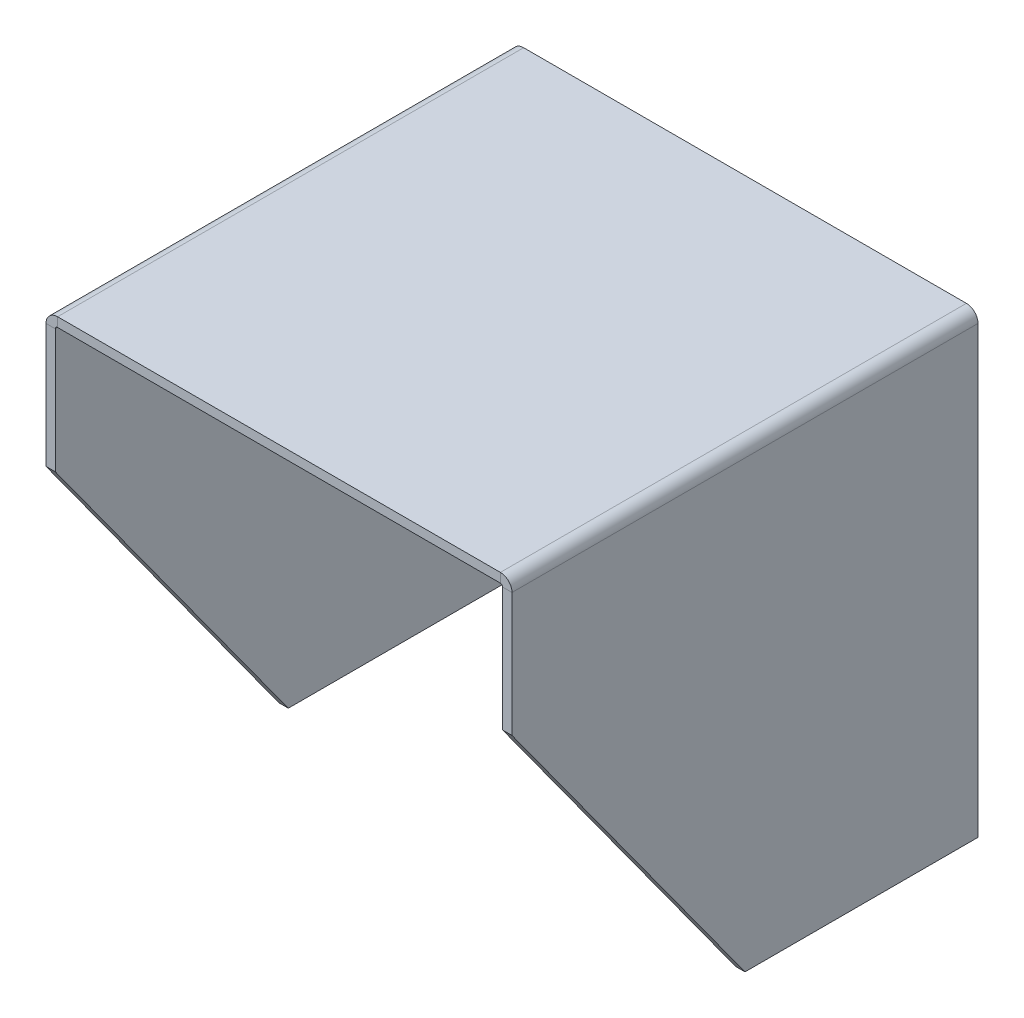
ISO-10303-21;
HEADER;
FILE_DESCRIPTION(('STEP AP214'),'2;1');
FILE_NAME('part.step','',(''),(''),'','','');
FILE_SCHEMA(('AUTOMOTIVE_DESIGN { 1 0 10303 214 1 1 1 1 }'));
ENDSEC;
DATA;
#1=APPLICATION_CONTEXT('core data for automotive mechanical design processes');
#2=APPLICATION_PROTOCOL_DEFINITION('international standard','automotive_design',2000,#1);
#3=PRODUCT_CONTEXT('',#1,'mechanical');
#4=PRODUCT('Part','Part','',(#3));
#5=PRODUCT_RELATED_PRODUCT_CATEGORY('part','',(#4));
#6=PRODUCT_DEFINITION_FORMATION('','',#4);
#7=PRODUCT_DEFINITION_CONTEXT('part definition',#1,'design');
#8=PRODUCT_DEFINITION('design','',#6,#7);
#9=PRODUCT_DEFINITION_SHAPE('','',#8);
#10=(LENGTH_UNIT() NAMED_UNIT(*) SI_UNIT(.MILLI.,.METRE.));
#11=(NAMED_UNIT(*) PLANE_ANGLE_UNIT() SI_UNIT($,.RADIAN.));
#12=(NAMED_UNIT(*) SI_UNIT($,.STERADIAN.) SOLID_ANGLE_UNIT());
#13=UNCERTAINTY_MEASURE_WITH_UNIT(LENGTH_MEASURE(1.E-05),#10,'distance_accuracy_value','');
#14=(GEOMETRIC_REPRESENTATION_CONTEXT(3) GLOBAL_UNCERTAINTY_ASSIGNED_CONTEXT((#13)) GLOBAL_UNIT_ASSIGNED_CONTEXT((#10,
#11,#12)) REPRESENTATION_CONTEXT('',''));
#15=CARTESIAN_POINT('',(0.,0.,0.));
#16=DIRECTION('',(0.,0.,1.));
#17=DIRECTION('',(1.,0.,0.));
#18=AXIS2_PLACEMENT_3D('',#15,#16,#17);
#19=CARTESIAN_POINT('',(-71.2634,75.,150.));
#20=DIRECTION('',(0.,0.,1.));
#21=DIRECTION('',(1.,0.,0.));
#22=AXIS2_PLACEMENT_3D('',#19,#20,#21);
#23=PLANE('',#22);
#24=DIRECTION('',(0.,1.,0.));
#25=VECTOR('',#24,1.);
#26=CARTESIAN_POINT('',(-75.,-72.,150.));
#27=LINE('',#26,#25);
#28=CARTESIAN_POINT('',(-75.,31.405620605715,150.));
#29=VERTEX_POINT('',#28);
#30=CARTESIAN_POINT('',(-75.,71.2634,150.));
#31=VERTEX_POINT('',#30);
#32=EDGE_CURVE('E224',#29,#31,#27,.T.);
#33=ORIENTED_EDGE('',*,*,#32,.F.);
#34=DIRECTION('',(1.,0.,0.));
#35=VECTOR('',#34,1.);
#36=CARTESIAN_POINT('',(-72.,31.405620605715,150.));
#37=LINE('',#36,#35);
#38=CARTESIAN_POINT('',(-72.,31.405620605715,150.));
#39=VERTEX_POINT('',#38);
#40=EDGE_CURVE('E214',#39,#29,#37,.F.);
#41=ORIENTED_EDGE('',*,*,#40,.F.);
#42=DIRECTION('',(0.,1.,0.));
#43=VECTOR('',#42,1.);
#44=CARTESIAN_POINT('',(-72.,-72.,150.));
#45=LINE('',#44,#43);
#46=CARTESIAN_POINT('',(-72.,71.2634,150.));
#47=VERTEX_POINT('',#46);
#48=EDGE_CURVE('E226',#39,#47,#45,.T.);
#49=ORIENTED_EDGE('',*,*,#48,.T.);
#50=DIRECTION('',(-1.,0.,0.));
#51=VECTOR('',#50,1.);
#52=CARTESIAN_POINT('',(-72.,71.2634,150.));
#53=LINE('',#52,#51);
#54=EDGE_CURVE('E173',#47,#31,#53,.T.);
#55=ORIENTED_EDGE('',*,*,#54,.T.);
#56=EDGE_LOOP('',(#33,#41,#49,#55));
#57=FACE_BOUND('',#56,.T.);
#58=ADVANCED_FACE('F37',(#57),#23,.T.);
#59=CARTESIAN_POINT('',(72.,-72.,150.));
#60=DIRECTION('',(1.,0.,0.));
#61=DIRECTION('',(0.,0.,-1.));
#62=AXIS2_PLACEMENT_3D('',#59,#60,#61);
#63=PLANE('',#62);
#64=DIRECTION('',(0.,0.809495381981235,0.587126244134134));
#65=VECTOR('',#64,1.);
#66=CARTESIAN_POINT('',(72.,-36.3543012550074,100.853791991329));
#67=LINE('',#66,#65);
#68=CARTESIAN_POINT('',(72.,-72.,75.));
#69=VERTEX_POINT('',#68);
#70=CARTESIAN_POINT('',(72.,31.405620605715,150.));
#71=VERTEX_POINT('',#70);
#72=EDGE_CURVE('E138',#69,#71,#67,.T.);
#73=ORIENTED_EDGE('',*,*,#72,.T.);
#74=DIRECTION('',(0.,-1.,0.));
#75=VECTOR('',#74,1.);
#76=CARTESIAN_POINT('',(72.,-72.,150.));
#77=LINE('',#76,#75);
#78=CARTESIAN_POINT('',(72.,71.2634,150.));
#79=VERTEX_POINT('',#78);
#80=EDGE_CURVE('E184',#79,#71,#77,.T.);
#81=ORIENTED_EDGE('',*,*,#80,.F.);
#82=DIRECTION('',(0.,0.,-1.));
#83=VECTOR('',#82,1.);
#84=CARTESIAN_POINT('',(72.,71.2634,150.));
#85=LINE('',#84,#83);
#86=CARTESIAN_POINT('',(72.,71.2634,0.));
#87=VERTEX_POINT('',#86);
#88=EDGE_CURVE('E194',#79,#87,#85,.T.);
#89=ORIENTED_EDGE('',*,*,#88,.T.);
#90=DIRECTION('',(0.,-1.,0.));
#91=VECTOR('',#90,1.);
#92=CARTESIAN_POINT('',(72.,-72.,0.));
#93=LINE('',#92,#91);
#94=CARTESIAN_POINT('',(72.,-72.,0.));
#95=VERTEX_POINT('',#94);
#96=EDGE_CURVE('E232',#87,#95,#93,.T.);
#97=ORIENTED_EDGE('',*,*,#96,.T.);
#98=DIRECTION('',(0.,0.,-1.));
#99=VECTOR('',#98,1.);
#100=CARTESIAN_POINT('',(72.,-72.,150.));
#101=LINE('',#100,#99);
#102=EDGE_CURVE('E158',#69,#95,#101,.T.);
#103=ORIENTED_EDGE('',*,*,#102,.F.);
#104=EDGE_LOOP('',(#73,#81,#89,#97,#103));
#105=FACE_BOUND('',#104,.T.);
#106=ADVANCED_FACE('F207',(#105),#63,.F.);
#107=CARTESIAN_POINT('',(75.,-72.,150.));
#108=DIRECTION('',(0.,-1.,0.));
#109=DIRECTION('',(0.,0.,-1.));
#110=AXIS2_PLACEMENT_3D('',#107,#108,#109);
#111=PLANE('',#110);
#112=DIRECTION('',(0.,0.,-1.));
#113=VECTOR('',#112,1.);
#114=CARTESIAN_POINT('',(75.,-72.,150.));
#115=LINE('',#114,#113);
#116=CARTESIAN_POINT('',(75.,-72.,75.));
#117=VERTEX_POINT('',#116);
#118=CARTESIAN_POINT('',(75.,-72.,0.));
#119=VERTEX_POINT('',#118);
#120=EDGE_CURVE('E148',#117,#119,#115,.T.);
#121=ORIENTED_EDGE('',*,*,#120,.F.);
#122=DIRECTION('',(-1.,0.,0.));
#123=VECTOR('',#122,1.);
#124=CARTESIAN_POINT('',(72.,-72.,75.));
#125=LINE('',#124,#123);
#126=EDGE_CURVE('E135',#69,#117,#125,.F.);
#127=ORIENTED_EDGE('',*,*,#126,.F.);
#128=ORIENTED_EDGE('',*,*,#102,.T.);
#129=DIRECTION('',(-1.,0.,0.));
#130=VECTOR('',#129,1.);
#131=CARTESIAN_POINT('',(75.,-72.,0.));
#132=LINE('',#131,#130);
#133=EDGE_CURVE('E156',#119,#95,#132,.T.);
#134=ORIENTED_EDGE('',*,*,#133,.F.);
#135=EDGE_LOOP('',(#121,#127,#128,#134));
#136=FACE_BOUND('',#135,.T.);
#137=ADVANCED_FACE('F154',(#136),#111,.T.);
#138=CARTESIAN_POINT('',(75.,-72.,150.));
#139=DIRECTION('',(1.,0.,0.));
#140=DIRECTION('',(0.,0.,-1.));
#141=AXIS2_PLACEMENT_3D('',#138,#139,#140);
#142=PLANE('',#141);
#143=DIRECTION('',(0.,1.,0.));
#144=VECTOR('',#143,1.);
#145=CARTESIAN_POINT('',(75.,-72.,150.));
#146=LINE('',#145,#144);
#147=CARTESIAN_POINT('',(75.,71.2634,150.));
#148=VERTEX_POINT('',#147);
#149=CARTESIAN_POINT('',(75.,31.405620605715,150.));
#150=VERTEX_POINT('',#149);
#151=EDGE_CURVE('E152',#148,#150,#146,.F.);
#152=ORIENTED_EDGE('',*,*,#151,.T.);
#153=DIRECTION('',(0.,0.809495381981235,0.587126244134134));
#154=VECTOR('',#153,1.);
#155=CARTESIAN_POINT('',(75.,-36.3543012550074,100.853791991329));
#156=LINE('',#155,#154);
#157=EDGE_CURVE('E60',#117,#150,#156,.T.);
#158=ORIENTED_EDGE('',*,*,#157,.F.);
#159=ORIENTED_EDGE('',*,*,#120,.T.);
#160=DIRECTION('',(0.,1.,0.));
#161=VECTOR('',#160,1.);
#162=CARTESIAN_POINT('',(75.,-72.,0.));
#163=LINE('',#162,#161);
#164=CARTESIAN_POINT('',(75.,71.2634,0.));
#165=VERTEX_POINT('',#164);
#166=EDGE_CURVE('E235',#165,#119,#163,.F.);
#167=ORIENTED_EDGE('',*,*,#166,.F.);
#168=DIRECTION('',(0.,0.,-1.));
#169=VECTOR('',#168,1.);
#170=CARTESIAN_POINT('',(75.,71.2634,150.));
#171=LINE('',#170,#169);
#172=EDGE_CURVE('E159',#148,#165,#171,.T.);
#173=ORIENTED_EDGE('',*,*,#172,.F.);
#174=EDGE_LOOP('',(#152,#158,#159,#167,#173));
#175=FACE_BOUND('',#174,.T.);
#176=ADVANCED_FACE('F146',(#175),#142,.T.);
#177=CARTESIAN_POINT('',(-75.,-72.,150.));
#178=DIRECTION('',(-1.,0.,0.));
#179=DIRECTION('',(0.,0.,1.));
#180=AXIS2_PLACEMENT_3D('',#177,#178,#179);
#181=PLANE('',#180);
#182=DIRECTION('',(0.,0.,-1.));
#183=VECTOR('',#182,1.);
#184=CARTESIAN_POINT('',(-75.,-72.,150.));
#185=LINE('',#184,#183);
#186=CARTESIAN_POINT('',(-75.,-72.,75.));
#187=VERTEX_POINT('',#186);
#188=CARTESIAN_POINT('',(-75.,-72.,0.));
#189=VERTEX_POINT('',#188);
#190=EDGE_CURVE('E269',#187,#189,#185,.T.);
#191=ORIENTED_EDGE('',*,*,#190,.F.);
#192=DIRECTION('',(0.,-0.809495381981235,-0.587126244134134));
#193=VECTOR('',#192,1.);
#194=CARTESIAN_POINT('',(-75.,-36.3543012550074,100.853791991329));
#195=LINE('',#194,#193);
#196=EDGE_CURVE('E572',#29,#187,#195,.T.);
#197=ORIENTED_EDGE('',*,*,#196,.F.);
#198=ORIENTED_EDGE('',*,*,#32,.T.);
#199=DIRECTION('',(0.,0.,-1.));
#200=VECTOR('',#199,1.);
#201=CARTESIAN_POINT('',(-75.,71.2634,150.));
#202=LINE('',#201,#200);
#203=CARTESIAN_POINT('',(-75.,71.2634,0.));
#204=VERTEX_POINT('',#203);
#205=EDGE_CURVE('E271',#31,#204,#202,.T.);
#206=ORIENTED_EDGE('',*,*,#205,.T.);
#207=DIRECTION('',(0.,1.,0.));
#208=VECTOR('',#207,1.);
#209=CARTESIAN_POINT('',(-75.,-72.,0.));
#210=LINE('',#209,#208);
#211=EDGE_CURVE('E246',#189,#204,#210,.T.);
#212=ORIENTED_EDGE('',*,*,#211,.F.);
#213=EDGE_LOOP('',(#191,#197,#198,#206,#212));
#214=FACE_BOUND('',#213,.T.);
#215=ADVANCED_FACE('F334',(#214),#181,.T.);
#216=CARTESIAN_POINT('',(-72.,-72.,150.));
#217=DIRECTION('',(0.,-1.,0.));
#218=DIRECTION('',(0.,0.,-1.));
#219=AXIS2_PLACEMENT_3D('',#216,#217,#218);
#220=PLANE('',#219);
#221=DIRECTION('',(0.,0.,-1.));
#222=VECTOR('',#221,1.);
#223=CARTESIAN_POINT('',(-72.,-72.,150.));
#224=LINE('',#223,#222);
#225=CARTESIAN_POINT('',(-72.,-72.,75.));
#226=VERTEX_POINT('',#225);
#227=CARTESIAN_POINT('',(-72.,-72.,0.));
#228=VERTEX_POINT('',#227);
#229=EDGE_CURVE('E267',#226,#228,#224,.T.);
#230=ORIENTED_EDGE('',*,*,#229,.F.);
#231=DIRECTION('',(1.,0.,0.));
#232=VECTOR('',#231,1.);
#233=CARTESIAN_POINT('',(-72.,-72.,75.));
#234=LINE('',#233,#232);
#235=EDGE_CURVE('E52',#226,#187,#234,.F.);
#236=ORIENTED_EDGE('',*,*,#235,.T.);
#237=ORIENTED_EDGE('',*,*,#190,.T.);
#238=DIRECTION('',(-1.,0.,0.));
#239=VECTOR('',#238,1.);
#240=CARTESIAN_POINT('',(-72.,-72.,0.));
#241=LINE('',#240,#239);
#242=EDGE_CURVE('E249',#228,#189,#241,.T.);
#243=ORIENTED_EDGE('',*,*,#242,.F.);
#244=EDGE_LOOP('',(#230,#236,#237,#243));
#245=FACE_BOUND('',#244,.T.);
#246=ADVANCED_FACE('F344',(#245),#220,.T.);
#247=CARTESIAN_POINT('',(-72.,-72.,150.));
#248=DIRECTION('',(-1.,0.,0.));
#249=DIRECTION('',(0.,0.,1.));
#250=AXIS2_PLACEMENT_3D('',#247,#248,#249);
#251=PLANE('',#250);
#252=DIRECTION('',(0.,-0.809495381981235,-0.587126244134134));
#253=VECTOR('',#252,1.);
#254=CARTESIAN_POINT('',(-72.,-36.3543012550074,100.853791991329));
#255=LINE('',#254,#253);
#256=EDGE_CURVE('E574',#39,#226,#255,.T.);
#257=ORIENTED_EDGE('',*,*,#256,.T.);
#258=ORIENTED_EDGE('',*,*,#229,.T.);
#259=DIRECTION('',(0.,1.,0.));
#260=VECTOR('',#259,1.);
#261=CARTESIAN_POINT('',(-72.,-72.,0.));
#262=LINE('',#261,#260);
#263=CARTESIAN_POINT('',(-72.,71.2634,0.));
#264=VERTEX_POINT('',#263);
#265=EDGE_CURVE('E252',#228,#264,#262,.T.);
#266=ORIENTED_EDGE('',*,*,#265,.T.);
#267=DIRECTION('',(0.,0.,-1.));
#268=VECTOR('',#267,1.);
#269=CARTESIAN_POINT('',(-72.,71.2634,150.));
#270=LINE('',#269,#268);
#271=EDGE_CURVE('E264',#47,#264,#270,.T.);
#272=ORIENTED_EDGE('',*,*,#271,.F.);
#273=ORIENTED_EDGE('',*,*,#48,.F.);
#274=EDGE_LOOP('',(#257,#258,#266,#272,#273));
#275=FACE_BOUND('',#274,.T.);
#276=ADVANCED_FACE('F348',(#275),#251,.F.);
#277=CARTESIAN_POINT('',(71.2634,71.2634,150.));
#278=DIRECTION('',(0.,0.,1.));
#279=DIRECTION('',(1.,0.,0.));
#280=AXIS2_PLACEMENT_3D('',#277,#278,#279);
#281=PLANE('',#280);
#282=ORIENTED_EDGE('',*,*,#80,.T.);
#283=DIRECTION('',(-1.,0.,0.));
#284=VECTOR('',#283,1.);
#285=CARTESIAN_POINT('',(72.,31.405620605715,150.));
#286=LINE('',#285,#284);
#287=EDGE_CURVE('E142',#71,#150,#286,.F.);
#288=ORIENTED_EDGE('',*,*,#287,.T.);
#289=ORIENTED_EDGE('',*,*,#151,.F.);
#290=DIRECTION('',(-1.,0.,0.));
#291=VECTOR('',#290,1.);
#292=CARTESIAN_POINT('',(75.,71.2634,150.));
#293=LINE('',#292,#291);
#294=EDGE_CURVE('E45',#148,#79,#293,.T.);
#295=ORIENTED_EDGE('',*,*,#294,.T.);
#296=EDGE_LOOP('',(#282,#288,#289,#295));
#297=FACE_BOUND('',#296,.T.);
#298=ADVANCED_FACE('F182',(#297),#281,.T.);
#299=CARTESIAN_POINT('',(71.2634,72.,150.));
#300=DIRECTION('',(0.,0.,1.));
#301=DIRECTION('',(1.,0.,0.));
#302=AXIS2_PLACEMENT_3D('',#299,#300,#301);
#303=PLANE('',#302);
#304=DIRECTION('',(0.,1.,0.));
#305=VECTOR('',#304,1.);
#306=CARTESIAN_POINT('',(71.2634,72.,150.));
#307=LINE('',#306,#305);
#308=CARTESIAN_POINT('',(71.2634,72.,150.));
#309=VERTEX_POINT('',#308);
#310=CARTESIAN_POINT('',(71.2634,75.,150.));
#311=VERTEX_POINT('',#310);
#312=EDGE_CURVE('E11',#309,#311,#307,.T.);
#313=ORIENTED_EDGE('',*,*,#312,.F.);
#314=CARTESIAN_POINT('',(71.2634,71.2634,150.));
#315=DIRECTION('',(0.,0.,-1.));
#316=DIRECTION('',(-1.,0.,0.));
#317=AXIS2_PLACEMENT_3D('',#314,#315,#316);
#318=CIRCLE('',#317,0.7366);
#319=EDGE_CURVE('E189',#309,#79,#318,.T.);
#320=ORIENTED_EDGE('',*,*,#319,.T.);
#321=ORIENTED_EDGE('',*,*,#294,.F.);
#322=CARTESIAN_POINT('',(71.2634,71.2634,150.));
#323=DIRECTION('',(0.,0.,1.));
#324=DIRECTION('',(1.,0.,0.));
#325=AXIS2_PLACEMENT_3D('',#322,#323,#324);
#326=CIRCLE('',#325,3.7366);
#327=EDGE_CURVE('E209',#311,#148,#326,.F.);
#328=ORIENTED_EDGE('',*,*,#327,.F.);
#329=EDGE_LOOP('',(#313,#320,#321,#328));
#330=FACE_BOUND('',#329,.T.);
#331=ADVANCED_FACE('F39',(#330),#303,.T.);
#332=CARTESIAN_POINT('',(75.,71.2634,150.));
#333=DIRECTION('',(0.,0.,1.));
#334=DIRECTION('',(1.,0.,0.));
#335=AXIS2_PLACEMENT_3D('',#332,#333,#334);
#336=PLANE('',#335);
#337=DIRECTION('',(1.,0.,0.));
#338=VECTOR('',#337,1.);
#339=CARTESIAN_POINT('',(72.,72.,150.));
#340=LINE('',#339,#338);
#341=CARTESIAN_POINT('',(-71.2634,72.,150.));
#342=VERTEX_POINT('',#341);
#343=EDGE_CURVE('E195',#342,#309,#340,.T.);
#344=ORIENTED_EDGE('',*,*,#343,.T.);
#345=ORIENTED_EDGE('',*,*,#312,.T.);
#346=DIRECTION('',(1.,0.,0.));
#347=VECTOR('',#346,1.);
#348=CARTESIAN_POINT('',(72.,75.,150.));
#349=LINE('',#348,#347);
#350=CARTESIAN_POINT('',(-71.2634,75.,150.));
#351=VERTEX_POINT('',#350);
#352=EDGE_CURVE('E218',#351,#311,#349,.T.);
#353=ORIENTED_EDGE('',*,*,#352,.F.);
#354=DIRECTION('',(0.,-1.,0.));
#355=VECTOR('',#354,1.);
#356=CARTESIAN_POINT('',(-71.2634,75.,150.));
#357=LINE('',#356,#355);
#358=EDGE_CURVE('E171',#351,#342,#357,.T.);
#359=ORIENTED_EDGE('',*,*,#358,.T.);
#360=EDGE_LOOP('',(#344,#345,#353,#359));
#361=FACE_BOUND('',#360,.T.);
#362=ADVANCED_FACE('F298',(#361),#336,.T.);
#363=CARTESIAN_POINT('',(72.,71.2634,0.));
#364=DIRECTION('',(0.,0.,-1.));
#365=DIRECTION('',(-1.,0.,0.));
#366=AXIS2_PLACEMENT_3D('',#363,#364,#365);
#367=PLANE('',#366);
#368=DIRECTION('',(1.,0.,0.));
#369=VECTOR('',#368,1.);
#370=CARTESIAN_POINT('',(72.,71.2634,0.));
#371=LINE('',#370,#369);
#372=EDGE_CURVE('E178',#87,#165,#371,.T.);
#373=ORIENTED_EDGE('',*,*,#372,.F.);
#374=CARTESIAN_POINT('',(71.2634,71.2634,0.));
#375=DIRECTION('',(0.,0.,-1.));
#376=DIRECTION('',(-1.,0.,0.));
#377=AXIS2_PLACEMENT_3D('',#374,#375,#376);
#378=CIRCLE('',#377,0.7366);
#379=CARTESIAN_POINT('',(71.2634,72.,0.));
#380=VERTEX_POINT('',#379);
#381=EDGE_CURVE('E201',#380,#87,#378,.T.);
#382=ORIENTED_EDGE('',*,*,#381,.F.);
#383=DIRECTION('',(0.,-1.,0.));
#384=VECTOR('',#383,1.);
#385=CARTESIAN_POINT('',(71.2634,75.,0.));
#386=LINE('',#385,#384);
#387=CARTESIAN_POINT('',(71.2634,75.,0.));
#388=VERTEX_POINT('',#387);
#389=EDGE_CURVE('E176',#388,#380,#386,.T.);
#390=ORIENTED_EDGE('',*,*,#389,.F.);
#391=CARTESIAN_POINT('',(71.2634,71.2634,0.));
#392=DIRECTION('',(0.,0.,1.));
#393=DIRECTION('',(1.,0.,0.));
#394=AXIS2_PLACEMENT_3D('',#391,#392,#393);
#395=CIRCLE('',#394,3.7366);
#396=EDGE_CURVE('E237',#388,#165,#395,.F.);
#397=ORIENTED_EDGE('',*,*,#396,.T.);
#398=EDGE_LOOP('',(#373,#382,#390,#397));
#399=FACE_BOUND('',#398,.T.);
#400=ADVANCED_FACE('F303',(#399),#367,.T.);
#401=CARTESIAN_POINT('',(71.2634,75.,0.));
#402=DIRECTION('',(0.,0.,-1.));
#403=DIRECTION('',(-1.,0.,0.));
#404=AXIS2_PLACEMENT_3D('',#401,#402,#403);
#405=PLANE('',#404);
#406=ORIENTED_EDGE('',*,*,#96,.F.);
#407=ORIENTED_EDGE('',*,*,#372,.T.);
#408=ORIENTED_EDGE('',*,*,#166,.T.);
#409=ORIENTED_EDGE('',*,*,#133,.T.);
#410=EDGE_LOOP('',(#406,#407,#408,#409));
#411=FACE_BOUND('',#410,.T.);
#412=ADVANCED_FACE('F305',(#411),#405,.T.);
#413=CARTESIAN_POINT('',(-72.,71.2634,150.));
#414=DIRECTION('',(0.,0.,1.));
#415=DIRECTION('',(1.,0.,0.));
#416=AXIS2_PLACEMENT_3D('',#413,#414,#415);
#417=PLANE('',#416);
#418=ORIENTED_EDGE('',*,*,#54,.F.);
#419=CARTESIAN_POINT('',(-71.2634,71.2634,150.));
#420=DIRECTION('',(0.,0.,-1.));
#421=DIRECTION('',(-1.,0.,0.));
#422=AXIS2_PLACEMENT_3D('',#419,#420,#421);
#423=CIRCLE('',#422,0.7366);
#424=EDGE_CURVE('E228',#47,#342,#423,.T.);
#425=ORIENTED_EDGE('',*,*,#424,.T.);
#426=ORIENTED_EDGE('',*,*,#358,.F.);
#427=CARTESIAN_POINT('',(-71.2634,71.2634,150.));
#428=DIRECTION('',(0.,0.,1.));
#429=DIRECTION('',(1.,0.,0.));
#430=AXIS2_PLACEMENT_3D('',#427,#428,#429);
#431=CIRCLE('',#430,3.7366);
#432=EDGE_CURVE('E221',#31,#351,#431,.F.);
#433=ORIENTED_EDGE('',*,*,#432,.F.);
#434=EDGE_LOOP('',(#418,#425,#426,#433));
#435=FACE_BOUND('',#434,.T.);
#436=ADVANCED_FACE('F307',(#435),#417,.T.);
#437=CARTESIAN_POINT('',(-71.2634,72.,0.));
#438=DIRECTION('',(0.,0.,-1.));
#439=DIRECTION('',(-1.,0.,0.));
#440=AXIS2_PLACEMENT_3D('',#437,#438,#439);
#441=PLANE('',#440);
#442=DIRECTION('',(0.,1.,0.));
#443=VECTOR('',#442,1.);
#444=CARTESIAN_POINT('',(-71.2634,72.,0.));
#445=LINE('',#444,#443);
#446=CARTESIAN_POINT('',(-71.2634,72.,0.));
#447=VERTEX_POINT('',#446);
#448=CARTESIAN_POINT('',(-71.2634,75.,0.));
#449=VERTEX_POINT('',#448);
#450=EDGE_CURVE('E169',#447,#449,#445,.T.);
#451=ORIENTED_EDGE('',*,*,#450,.F.);
#452=CARTESIAN_POINT('',(-71.2634,71.2634,0.));
#453=DIRECTION('',(0.,0.,-1.));
#454=DIRECTION('',(-1.,0.,0.));
#455=AXIS2_PLACEMENT_3D('',#452,#453,#454);
#456=CIRCLE('',#455,0.7366);
#457=EDGE_CURVE('E255',#264,#447,#456,.T.);
#458=ORIENTED_EDGE('',*,*,#457,.F.);
#459=DIRECTION('',(1.,0.,0.));
#460=VECTOR('',#459,1.);
#461=CARTESIAN_POINT('',(-75.,71.2634,0.));
#462=LINE('',#461,#460);
#463=EDGE_CURVE('E161',#204,#264,#462,.T.);
#464=ORIENTED_EDGE('',*,*,#463,.F.);
#465=CARTESIAN_POINT('',(-71.2634,71.2634,0.));
#466=DIRECTION('',(0.,0.,1.));
#467=DIRECTION('',(1.,0.,0.));
#468=AXIS2_PLACEMENT_3D('',#465,#466,#467);
#469=CIRCLE('',#468,3.7366);
#470=EDGE_CURVE('E243',#204,#449,#469,.F.);
#471=ORIENTED_EDGE('',*,*,#470,.T.);
#472=EDGE_LOOP('',(#451,#458,#464,#471));
#473=FACE_BOUND('',#472,.T.);
#474=ADVANCED_FACE('F313',(#473),#441,.T.);
#475=CARTESIAN_POINT('',(-75.,71.2634,0.));
#476=DIRECTION('',(0.,0.,-1.));
#477=DIRECTION('',(-1.,0.,0.));
#478=AXIS2_PLACEMENT_3D('',#475,#476,#477);
#479=PLANE('',#478);
#480=DIRECTION('',(1.,0.,0.));
#481=VECTOR('',#480,1.);
#482=CARTESIAN_POINT('',(72.,72.,0.));
#483=LINE('',#482,#481);
#484=EDGE_CURVE('E211',#447,#380,#483,.T.);
#485=ORIENTED_EDGE('',*,*,#484,.F.);
#486=ORIENTED_EDGE('',*,*,#450,.T.);
#487=DIRECTION('',(1.,0.,0.));
#488=VECTOR('',#487,1.);
#489=CARTESIAN_POINT('',(72.,75.,0.));
#490=LINE('',#489,#488);
#491=EDGE_CURVE('E240',#449,#388,#490,.T.);
#492=ORIENTED_EDGE('',*,*,#491,.T.);
#493=ORIENTED_EDGE('',*,*,#389,.T.);
#494=EDGE_LOOP('',(#485,#486,#492,#493));
#495=FACE_BOUND('',#494,.T.);
#496=ADVANCED_FACE('F289',(#495),#479,.T.);
#497=CARTESIAN_POINT('',(71.2634,71.2634,150.));
#498=DIRECTION('',(0.,0.,-1.));
#499=DIRECTION('',(-1.,0.,0.));
#500=AXIS2_PLACEMENT_3D('',#497,#498,#499);
#501=CYLINDRICAL_SURFACE('',#500,3.7366);
#502=ORIENTED_EDGE('',*,*,#396,.F.);
#503=DIRECTION('',(0.,0.,-1.));
#504=VECTOR('',#503,1.);
#505=CARTESIAN_POINT('',(71.2634,75.,150.));
#506=LINE('',#505,#504);
#507=EDGE_CURVE('E164',#311,#388,#506,.T.);
#508=ORIENTED_EDGE('',*,*,#507,.F.);
#509=ORIENTED_EDGE('',*,*,#327,.T.);
#510=ORIENTED_EDGE('',*,*,#172,.T.);
#511=EDGE_LOOP('',(#502,#508,#509,#510));
#512=FACE_BOUND('',#511,.T.);
#513=ADVANCED_FACE('F285',(#512),#501,.T.);
#514=CARTESIAN_POINT('',(72.,75.,150.));
#515=DIRECTION('',(0.,1.,0.));
#516=DIRECTION('',(0.,0.,1.));
#517=AXIS2_PLACEMENT_3D('',#514,#515,#516);
#518=PLANE('',#517);
#519=ORIENTED_EDGE('',*,*,#491,.F.);
#520=DIRECTION('',(0.,0.,-1.));
#521=VECTOR('',#520,1.);
#522=CARTESIAN_POINT('',(-71.2634,75.,150.));
#523=LINE('',#522,#521);
#524=EDGE_CURVE('E274',#351,#449,#523,.T.);
#525=ORIENTED_EDGE('',*,*,#524,.F.);
#526=ORIENTED_EDGE('',*,*,#352,.T.);
#527=ORIENTED_EDGE('',*,*,#507,.T.);
#528=EDGE_LOOP('',(#519,#525,#526,#527));
#529=FACE_BOUND('',#528,.T.);
#530=ADVANCED_FACE('F281',(#529),#518,.T.);
#531=CARTESIAN_POINT('',(-71.2634,71.2634,150.));
#532=DIRECTION('',(0.,0.,-1.));
#533=DIRECTION('',(-1.,0.,0.));
#534=AXIS2_PLACEMENT_3D('',#531,#532,#533);
#535=CYLINDRICAL_SURFACE('',#534,3.7366);
#536=ORIENTED_EDGE('',*,*,#470,.F.);
#537=ORIENTED_EDGE('',*,*,#205,.F.);
#538=ORIENTED_EDGE('',*,*,#432,.T.);
#539=ORIENTED_EDGE('',*,*,#524,.T.);
#540=EDGE_LOOP('',(#536,#537,#538,#539));
#541=FACE_BOUND('',#540,.T.);
#542=ADVANCED_FACE('F294',(#541),#535,.T.);
#543=CARTESIAN_POINT('',(-71.2634,71.2634,150.));
#544=DIRECTION('',(0.,0.,-1.));
#545=DIRECTION('',(-1.,0.,0.));
#546=AXIS2_PLACEMENT_3D('',#543,#544,#545);
#547=CYLINDRICAL_SURFACE('',#546,0.7366);
#548=ORIENTED_EDGE('',*,*,#457,.T.);
#549=DIRECTION('',(0.,0.,-1.));
#550=VECTOR('',#549,1.);
#551=CARTESIAN_POINT('',(-71.2634,72.,150.));
#552=LINE('',#551,#550);
#553=EDGE_CURVE('E261',#342,#447,#552,.T.);
#554=ORIENTED_EDGE('',*,*,#553,.F.);
#555=ORIENTED_EDGE('',*,*,#424,.F.);
#556=ORIENTED_EDGE('',*,*,#271,.T.);
#557=EDGE_LOOP('',(#548,#554,#555,#556));
#558=FACE_BOUND('',#557,.T.);
#559=ADVANCED_FACE('F341',(#558),#547,.F.);
#560=CARTESIAN_POINT('',(72.,72.,150.));
#561=DIRECTION('',(0.,1.,0.));
#562=DIRECTION('',(0.,0.,1.));
#563=AXIS2_PLACEMENT_3D('',#560,#561,#562);
#564=PLANE('',#563);
#565=ORIENTED_EDGE('',*,*,#484,.T.);
#566=DIRECTION('',(0.,0.,-1.));
#567=VECTOR('',#566,1.);
#568=CARTESIAN_POINT('',(71.2634,72.,150.));
#569=LINE('',#568,#567);
#570=EDGE_CURVE('E205',#309,#380,#569,.T.);
#571=ORIENTED_EDGE('',*,*,#570,.F.);
#572=ORIENTED_EDGE('',*,*,#343,.F.);
#573=ORIENTED_EDGE('',*,*,#553,.T.);
#574=EDGE_LOOP('',(#565,#571,#572,#573));
#575=FACE_BOUND('',#574,.T.);
#576=ADVANCED_FACE('F302',(#575),#564,.F.);
#577=CARTESIAN_POINT('',(71.2634,71.2634,150.));
#578=DIRECTION('',(0.,0.,-1.));
#579=DIRECTION('',(-1.,0.,0.));
#580=AXIS2_PLACEMENT_3D('',#577,#578,#579);
#581=CYLINDRICAL_SURFACE('',#580,0.7366);
#582=ORIENTED_EDGE('',*,*,#381,.T.);
#583=ORIENTED_EDGE('',*,*,#88,.F.);
#584=ORIENTED_EDGE('',*,*,#319,.F.);
#585=ORIENTED_EDGE('',*,*,#570,.T.);
#586=EDGE_LOOP('',(#582,#583,#584,#585));
#587=FACE_BOUND('',#586,.T.);
#588=ADVANCED_FACE('F199',(#587),#581,.F.);
#589=CARTESIAN_POINT('',(71.2634,71.2634,0.));
#590=DIRECTION('',(0.,0.,1.));
#591=DIRECTION('',(1.,0.,0.));
#592=AXIS2_PLACEMENT_3D('',#589,#590,#591);
#593=PLANE('',#592);
#594=ORIENTED_EDGE('',*,*,#211,.T.);
#595=ORIENTED_EDGE('',*,*,#463,.T.);
#596=ORIENTED_EDGE('',*,*,#265,.F.);
#597=ORIENTED_EDGE('',*,*,#242,.T.);
#598=EDGE_LOOP('',(#594,#595,#596,#597));
#599=FACE_BOUND('',#598,.T.);
#600=ADVANCED_FACE('F360',(#599),#593,.F.);
#601=CARTESIAN_POINT('',(72.,-36.3543012550074,100.853791991329));
#602=DIRECTION('',(0.,0.587126244134134,-0.809495381981235));
#603=DIRECTION('',(0.,0.809495381981235,0.587126244134134));
#604=AXIS2_PLACEMENT_3D('',#601,#602,#603);
#605=PLANE('',#604);
#606=ORIENTED_EDGE('',*,*,#287,.F.);
#607=ORIENTED_EDGE('',*,*,#72,.F.);
#608=ORIENTED_EDGE('',*,*,#126,.T.);
#609=ORIENTED_EDGE('',*,*,#157,.T.);
#610=EDGE_LOOP('',(#606,#607,#608,#609));
#611=FACE_BOUND('',#610,.T.);
#612=ADVANCED_FACE('F136',(#611),#605,.F.);
#613=CARTESIAN_POINT('',(-72.,-36.3543012550074,100.853791991329));
#614=DIRECTION('',(0.,0.587126244134134,-0.809495381981235));
#615=DIRECTION('',(0.,-0.809495381981235,-0.587126244134134));
#616=AXIS2_PLACEMENT_3D('',#613,#614,#615);
#617=PLANE('',#616);
#618=ORIENTED_EDGE('',*,*,#235,.F.);
#619=ORIENTED_EDGE('',*,*,#256,.F.);
#620=ORIENTED_EDGE('',*,*,#40,.T.);
#621=ORIENTED_EDGE('',*,*,#196,.T.);
#622=EDGE_LOOP('',(#618,#619,#620,#621));
#623=FACE_BOUND('',#622,.T.);
#624=ADVANCED_FACE('F366',(#623),#617,.F.);
#625=CLOSED_SHELL('',(#58,#106,#137,#176,#215,#246,#276,#298,#331,#362,#400,#412,#436,#474,#496,
#513,#530,#542,#559,#576,#588,#600,#612,#624));
#626=MANIFOLD_SOLID_BREP('B2',#625);
#627=ADVANCED_BREP_SHAPE_REPRESENTATION('',(#18,#626),#14);
#628=SHAPE_DEFINITION_REPRESENTATION(#9,#627);
ENDSEC;
END-ISO-10303-21;
